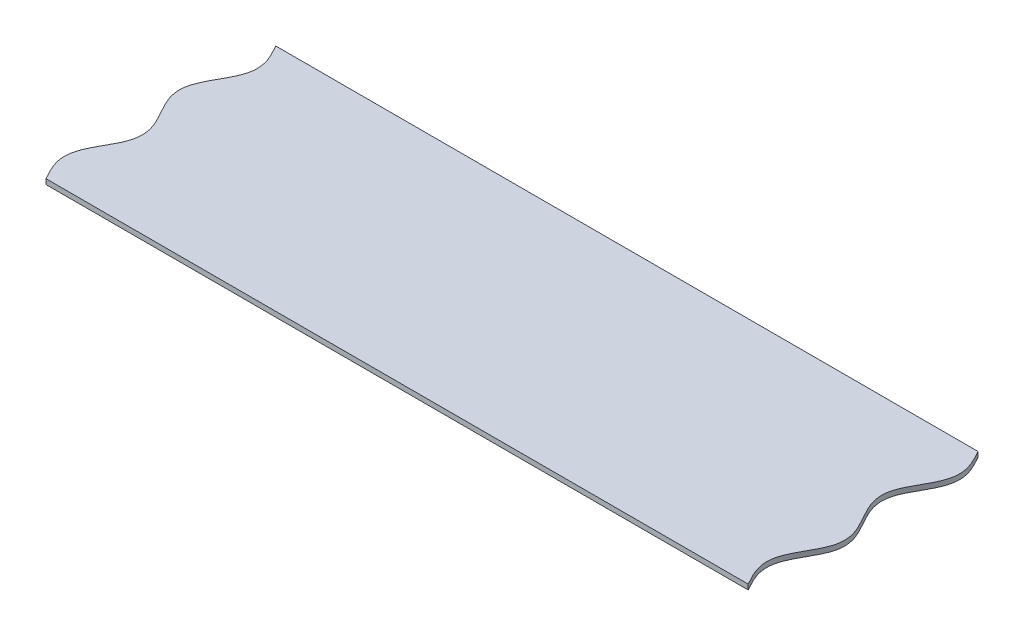
ISO-10303-21;
HEADER;
FILE_DESCRIPTION(('STEP AP214'),'2;1');
FILE_NAME('part.step','',(''),(''),'','','');
FILE_SCHEMA(('AUTOMOTIVE_DESIGN { 1 0 10303 214 1 1 1 1 }'));
ENDSEC;
DATA;
#1=APPLICATION_CONTEXT('core data for automotive mechanical design processes');
#2=APPLICATION_PROTOCOL_DEFINITION('international standard','automotive_design',2000,#1);
#3=PRODUCT_CONTEXT('',#1,'mechanical');
#4=PRODUCT('Part','Part','',(#3));
#5=PRODUCT_RELATED_PRODUCT_CATEGORY('part','',(#4));
#6=PRODUCT_DEFINITION_FORMATION('','',#4);
#7=PRODUCT_DEFINITION_CONTEXT('part definition',#1,'design');
#8=PRODUCT_DEFINITION('design','',#6,#7);
#9=PRODUCT_DEFINITION_SHAPE('','',#8);
#10=(LENGTH_UNIT() NAMED_UNIT(*) SI_UNIT(.MILLI.,.METRE.));
#11=(NAMED_UNIT(*) PLANE_ANGLE_UNIT() SI_UNIT($,.RADIAN.));
#12=(NAMED_UNIT(*) SI_UNIT($,.STERADIAN.) SOLID_ANGLE_UNIT());
#13=UNCERTAINTY_MEASURE_WITH_UNIT(LENGTH_MEASURE(1.E-05),#10,'distance_accuracy_value','');
#14=(GEOMETRIC_REPRESENTATION_CONTEXT(3) GLOBAL_UNCERTAINTY_ASSIGNED_CONTEXT((#13)) GLOBAL_UNIT_ASSIGNED_CONTEXT((#10,
#11,#12)) REPRESENTATION_CONTEXT('',''));
#15=CARTESIAN_POINT('',(0.,0.,0.));
#16=DIRECTION('',(0.,0.,1.));
#17=DIRECTION('',(1.,0.,0.));
#18=AXIS2_PLACEMENT_3D('',#15,#16,#17);
#19=CARTESIAN_POINT('',(-5.58170452742636E-08,0.4,-9.99341588722323E-08));
#20=CARTESIAN_POINT('',(0.0325246361291489,0.4,0.0582317103069612));
#21=CARTESIAN_POINT('',(0.0967328106936507,0.4,0.173184303372485));
#22=CARTESIAN_POINT('',(0.291982250759605,0.4,0.52619217590146));
#23=CARTESIAN_POINT('',(0.445208277670781,0.4,0.832698965412081));
#24=CARTESIAN_POINT('',(0.623865980151338,0.4,1.24407361378798));
#25=CARTESIAN_POINT('',(0.759592363237738,0.4,1.72118166675855));
#26=CARTESIAN_POINT('',(0.832859934923318,0.4,2.25154155185734));
#27=CARTESIAN_POINT('',(0.750726938043106,0.4,2.96558695409423));
#28=CARTESIAN_POINT('',(0.443708738434378,0.4,3.71577035640966));
#29=CARTESIAN_POINT('',(0.0504783736851124,0.4,4.41030283856117));
#30=CARTESIAN_POINT('',(-0.348670519029739,0.4,5.12241356073318));
#31=CARTESIAN_POINT('',(-0.648651089756492,0.4,5.7703470826826));
#32=CARTESIAN_POINT('',(-0.82672624794342,0.4,6.46899626847285));
#33=CARTESIAN_POINT('',(-0.7986136200232,0.4,7.25099648989018));
#34=CARTESIAN_POINT('',(-0.495285138172172,0.4,8.14226671619661));
#35=CARTESIAN_POINT('',(-7.22769396650366E-05,0.4,8.99998149250639));
#36=CARTESIAN_POINT('',(0.495425821745265,0.4,9.85776085122949));
#37=CARTESIAN_POINT('',(0.799655367243381,0.4,10.7484079758009));
#38=CARTESIAN_POINT('',(0.829148191709096,0.4,11.5306438006231));
#39=CARTESIAN_POINT('',(0.651829085490575,0.4,12.22905836892));
#40=CARTESIAN_POINT('',(0.389255062631136,0.4,12.7986412222162));
#41=CARTESIAN_POINT('',(0.131311319069625,0.4,13.2713983704557));
#42=CARTESIAN_POINT('',(-0.107552617844786,0.4,13.6967908903107));
#43=CARTESIAN_POINT('',(-0.324807927344972,0.4,14.0918313269295));
#44=CARTESIAN_POINT('',(-0.559532557967269,0.4,14.5777762998583));
#45=CARTESIAN_POINT('',(-0.765316945934337,0.4,15.1703385530119));
#46=CARTESIAN_POINT('',(-0.828444310587086,0.4,15.7519466591617));
#47=CARTESIAN_POINT('',(-0.762210707475533,0.4,16.2719762814522));
#48=CARTESIAN_POINT('',(-0.638913334329335,0.4,16.6907272139578));
#49=CARTESIAN_POINT('',(-0.52318723028198,0.4,16.9915644817052));
#50=CARTESIAN_POINT('',(-0.37091554487841,0.4,17.313254228399));
#51=CARTESIAN_POINT('',(-0.251032904852001,0.4,17.5477683372978));
#52=CARTESIAN_POINT('',(-0.0973118355511862,0.4,17.8257504179934));
#53=CARTESIAN_POINT('',(-0.0325246236280025,0.4,17.9417681484702));
#54=CARTESIAN_POINT('',(5.94193819027072E-12,0.4,18.0000000000106));
#55=B_SPLINE_CURVE_WITH_KNOTS('',4,(#19,#20,#21,#22,#23,#24,#25,#26,#27,#28,#29,#30,#31,#32,#33,
#34,#35,#36,#37,#38,#39,#40,#41,#42,#43,#44,#45,#46,#47,#48,#49,#50,#51,#52,#53,#54),
.UNSPECIFIED.,.F.,.F.,(5,1,1,1,1,1,1,1,1,1,1,1,1,1,1,1,1,1,1,1,1,1,1,1,1,1,1,1,1,1,1,1,5),
(0.0831333415081067,0.0969355766026035,0.110737817618864,0.138342299651385,0.153420911727594,
0.168499523803803,0.198656548097112,0.228813603984349,0.27648331462802,0.306640636588557,
0.336797958549095,0.369388933775316,0.399545924472748,0.429703067764272,0.469833247335096,
0.530147989865572,0.570278162450154,0.600435313453212,0.630592300086219,0.663183275804327,
0.6933405991003,0.708419260748287,0.723497922396273,0.747332774825081,0.771167627253889,
0.801324696016065,0.8314817160139,0.846560325859882,0.861638935705865,0.875441177287961,
0.889243418870057,0.903045660452153,0.916847902034249),.UNSPECIFIED.);
#56=DIRECTION('',(0.,-1.,0.));
#57=VECTOR('',#56,1.);
#58=SURFACE_OF_LINEAR_EXTRUSION('',#55,#57);
#59=CARTESIAN_POINT('',(-5.58170452742636E-08,0.,-9.99341588722323E-08));
#60=CARTESIAN_POINT('',(0.0325246361291489,0.,0.0582317103069612));
#61=CARTESIAN_POINT('',(0.0967328106936507,0.,0.173184303372485));
#62=CARTESIAN_POINT('',(0.291982250759605,0.,0.52619217590146));
#63=CARTESIAN_POINT('',(0.445208277670781,0.,0.832698965412081));
#64=CARTESIAN_POINT('',(0.623865980151338,0.,1.24407361378798));
#65=CARTESIAN_POINT('',(0.759592363237738,0.,1.72118166675855));
#66=CARTESIAN_POINT('',(0.832859934923318,0.,2.25154155185734));
#67=CARTESIAN_POINT('',(0.750726938043106,0.,2.96558695409423));
#68=CARTESIAN_POINT('',(0.443708738434378,0.,3.71577035640966));
#69=CARTESIAN_POINT('',(0.0504783736851124,0.,4.41030283856117));
#70=CARTESIAN_POINT('',(-0.348670519029739,0.,5.12241356073318));
#71=CARTESIAN_POINT('',(-0.648651089756492,0.,5.7703470826826));
#72=CARTESIAN_POINT('',(-0.82672624794342,0.,6.46899626847285));
#73=CARTESIAN_POINT('',(-0.7986136200232,0.,7.25099648989018));
#74=CARTESIAN_POINT('',(-0.495285138172172,0.,8.14226671619661));
#75=CARTESIAN_POINT('',(-7.22769396650366E-05,0.,8.99998149250639));
#76=CARTESIAN_POINT('',(0.495425821745265,0.,9.85776085122949));
#77=CARTESIAN_POINT('',(0.799655367243381,0.,10.7484079758009));
#78=CARTESIAN_POINT('',(0.829148191709096,0.,11.5306438006231));
#79=CARTESIAN_POINT('',(0.651829085490575,0.,12.22905836892));
#80=CARTESIAN_POINT('',(0.389255062631136,0.,12.7986412222162));
#81=CARTESIAN_POINT('',(0.131311319069625,0.,13.2713983704557));
#82=CARTESIAN_POINT('',(-0.107552617844786,0.,13.6967908903107));
#83=CARTESIAN_POINT('',(-0.324807927344972,0.,14.0918313269295));
#84=CARTESIAN_POINT('',(-0.559532557967269,0.,14.5777762998583));
#85=CARTESIAN_POINT('',(-0.765316945934337,0.,15.1703385530119));
#86=CARTESIAN_POINT('',(-0.828444310587086,0.,15.7519466591617));
#87=CARTESIAN_POINT('',(-0.762210707475533,0.,16.2719762814522));
#88=CARTESIAN_POINT('',(-0.638913334329335,0.,16.6907272139578));
#89=CARTESIAN_POINT('',(-0.52318723028198,0.,16.9915644817052));
#90=CARTESIAN_POINT('',(-0.37091554487841,0.,17.313254228399));
#91=CARTESIAN_POINT('',(-0.251032904852001,0.,17.5477683372978));
#92=CARTESIAN_POINT('',(-0.0973118355511862,0.,17.8257504179934));
#93=CARTESIAN_POINT('',(-0.0325246236280025,0.,17.9417681484702));
#94=CARTESIAN_POINT('',(5.94193819027072E-12,0.,18.0000000000106));
#95=B_SPLINE_CURVE_WITH_KNOTS('',4,(#59,#60,#61,#62,#63,#64,#65,#66,#67,#68,#69,#70,#71,#72,#73,
#74,#75,#76,#77,#78,#79,#80,#81,#82,#83,#84,#85,#86,#87,#88,#89,#90,#91,#92,#93,#94),
.UNSPECIFIED.,.F.,.F.,(5,1,1,1,1,1,1,1,1,1,1,1,1,1,1,1,1,1,1,1,1,1,1,1,1,1,1,1,1,1,1,1,5),
(0.0831333415081067,0.0969355766026035,0.110737817618864,0.138342299651385,0.153420911727594,
0.168499523803803,0.198656548097112,0.228813603984349,0.27648331462802,0.306640636588557,
0.336797958549095,0.369388933775316,0.399545924472748,0.429703067764272,0.469833247335096,
0.530147989865572,0.570278162450154,0.600435313453212,0.630592300086219,0.663183275804327,
0.6933405991003,0.708419260748287,0.723497922396273,0.747332774825081,0.771167627253889,
0.801324696016065,0.8314817160139,0.846560325859882,0.861638935705865,0.875441177287961,
0.889243418870057,0.903045660452153,0.916847902034249),.UNSPECIFIED.);
#96=CARTESIAN_POINT('',(0.,0.,0.));
#97=VERTEX_POINT('',#96);
#98=CARTESIAN_POINT('',(0.,0.,18.));
#99=VERTEX_POINT('',#98);
#100=EDGE_CURVE('E122',#97,#99,#95,.T.);
#101=ORIENTED_EDGE('',*,*,#100,.T.);
#102=DIRECTION('',(0.,-1.,0.));
#103=VECTOR('',#102,1.);
#104=CARTESIAN_POINT('',(0.,0.4,18.));
#105=LINE('',#104,#103);
#106=CARTESIAN_POINT('',(0.,0.4,18.));
#107=VERTEX_POINT('',#106);
#108=EDGE_CURVE('E11',#107,#99,#105,.T.);
#109=ORIENTED_EDGE('',*,*,#108,.F.);
#110=CARTESIAN_POINT('',(0.,0.4,0.));
#111=VERTEX_POINT('',#110);
#112=EDGE_CURVE('E91',#111,#107,#55,.T.);
#113=ORIENTED_EDGE('',*,*,#112,.F.);
#114=DIRECTION('',(0.,-1.,0.));
#115=VECTOR('',#114,1.);
#116=CARTESIAN_POINT('',(0.,0.4,0.));
#117=LINE('',#116,#115);
#118=EDGE_CURVE('E99',#111,#97,#117,.T.);
#119=ORIENTED_EDGE('',*,*,#118,.T.);
#120=EDGE_LOOP('',(#101,#109,#113,#119));
#121=FACE_BOUND('',#120,.T.);
#122=ADVANCED_FACE('F39',(#121),#58,.F.);
#123=CARTESIAN_POINT('',(55.,0.4,18.));
#124=DIRECTION('',(0.,0.,-1.));
#125=DIRECTION('',(-1.,0.,0.));
#126=AXIS2_PLACEMENT_3D('',#123,#124,#125);
#127=PLANE('',#126);
#128=DIRECTION('',(1.,0.,0.));
#129=VECTOR('',#128,1.);
#130=CARTESIAN_POINT('',(55.,0.,18.));
#131=LINE('',#130,#129);
#132=CARTESIAN_POINT('',(55.,0.,18.));
#133=VERTEX_POINT('',#132);
#134=EDGE_CURVE('E95',#99,#133,#131,.T.);
#135=ORIENTED_EDGE('',*,*,#134,.T.);
#136=DIRECTION('',(0.,-1.,0.));
#137=VECTOR('',#136,1.);
#138=CARTESIAN_POINT('',(55.,0.4,18.));
#139=LINE('',#138,#137);
#140=CARTESIAN_POINT('',(55.,0.4,18.));
#141=VERTEX_POINT('',#140);
#142=EDGE_CURVE('E48',#141,#133,#139,.T.);
#143=ORIENTED_EDGE('',*,*,#142,.F.);
#144=DIRECTION('',(1.,0.,0.));
#145=VECTOR('',#144,1.);
#146=CARTESIAN_POINT('',(55.,0.4,18.));
#147=LINE('',#146,#145);
#148=EDGE_CURVE('E86',#107,#141,#147,.T.);
#149=ORIENTED_EDGE('',*,*,#148,.F.);
#150=ORIENTED_EDGE('',*,*,#108,.T.);
#151=EDGE_LOOP('',(#135,#143,#149,#150));
#152=FACE_BOUND('',#151,.T.);
#153=ADVANCED_FACE('F94',(#152),#127,.F.);
#154=CARTESIAN_POINT('',(55.,0.4,18.));
#155=CARTESIAN_POINT('',(54.9674753765008,0.4,17.9417681487008));
#156=CARTESIAN_POINT('',(54.9027202884905,0.4,17.8258082156632));
#157=CARTESIAN_POINT('',(54.7492351508635,0.4,17.5482485311464));
#158=CARTESIAN_POINT('',(54.6288206352155,0.4,17.3127812640125));
#159=CARTESIAN_POINT('',(54.4769764896039,0.4,16.9918584269276));
#160=CARTESIAN_POINT('',(54.3610011192954,0.4,16.6905735432826));
#161=CARTESIAN_POINT('',(54.2378448673036,0.4,16.272076234869));
#162=CARTESIAN_POINT('',(54.1715158495587,0.4,15.7518747211653));
#163=CARTESIAN_POINT('',(54.2347102242873,0.4,15.1703875996461));
#164=CARTESIAN_POINT('',(54.4404493381463,0.4,14.577743855128));
#165=CARTESIAN_POINT('',(54.6752035613737,0.4,14.0918518921614));
#166=CARTESIAN_POINT('',(54.8924409656504,0.4,13.6967793938985));
#167=CARTESIAN_POINT('',(55.1313157015191,0.4,13.2714065505497));
#168=CARTESIAN_POINT('',(55.3892510732092,0.4,12.7986332961022));
#169=CARTESIAN_POINT('',(55.6518327999066,0.4,12.2290662728502));
#170=CARTESIAN_POINT('',(55.8291443910958,0.4,11.5306351960209));
#171=CARTESIAN_POINT('',(55.7996603664192,0.4,10.7484200452914));
#172=CARTESIAN_POINT('',(55.4954164971433,0.4,9.8577380554658));
#173=CARTESIAN_POINT('',(54.9999451827351,0.4,9.0000240249605));
#174=CARTESIAN_POINT('',(54.5046899462964,0.4,8.14220605976102));
#175=CARTESIAN_POINT('',(54.2014161349178,0.4,7.25106914201819));
#176=CARTESIAN_POINT('',(54.1732226961072,0.4,6.46887128682535));
#177=CARTESIAN_POINT('',(54.3514448414002,0.4,5.77058212710425));
#178=CARTESIAN_POINT('',(54.6511460127565,0.4,5.12196439950694));
#179=CARTESIAN_POINT('',(55.0508222238208,0.4,4.41114703190972));
#180=CARTESIAN_POINT('',(55.4431329910513,0.4,3.71434568871832));
#181=CARTESIAN_POINT('',(55.7178581640772,0.4,3.04910516458675));
#182=CARTESIAN_POINT('',(55.8121864627325,0.4,2.42501999239361));
#183=CARTESIAN_POINT('',(55.7979129623168,0.4,2.03100496406801));
#184=CARTESIAN_POINT('',(55.7598426255465,0.4,1.77104846639722));
#185=CARTESIAN_POINT('',(55.7105830653363,0.4,1.55808365198125));
#186=CARTESIAN_POINT('',(55.6621200151019,0.4,1.39012928445238));
#187=CARTESIAN_POINT('',(55.6064811076032,0.4,1.22803176322842));
#188=CARTESIAN_POINT('',(55.5457215452142,0.4,1.07206752498808));
#189=CARTESIAN_POINT('',(55.4898654897218,0.4,0.941699093404553));
#190=CARTESIAN_POINT('',(55.4372777687635,0.4,0.827999896575921));
#191=CARTESIAN_POINT('',(55.3929650322242,0.4,0.735760229529608));
#192=CARTESIAN_POINT('',(55.3598666770834,0.4,0.668018936471949));
#193=CARTESIAN_POINT('',(55.2840842797312,0.4,0.513554697790552));
#194=CARTESIAN_POINT('',(55.1340100572248,0.4,0.239928811409299));
#195=CARTESIAN_POINT('',(55.0650493613452,0.4,0.116463580113935));
#196=CARTESIAN_POINT('',(54.9999999777105,0.4,-3.99069456679443E-08));
#197=B_SPLINE_CURVE_WITH_KNOTS('',4,(#154,#155,#156,#157,#158,#159,#160,#161,#162,#163,#164,
#165,#166,#167,#168,#169,#170,#171,#172,#173,#174,#175,#176,#177,#178,#179,#180,#181,#182,#183,
#184,#185,#186,#187,#188,#189,#190,#191,#192,#193,#194,#195,#196),.UNSPECIFIED.,.F.,.F.,(5,1,1,
1,1,1,1,1,1,1,1,1,1,1,1,1,1,1,1,1,1,1,1,1,1,1,1,1,1,1,1,1,1,1,1,1,1,1,1,5),(0.0831333382870701,
0.0969355798635446,0.110737821440019,0.124540063016494,0.138342304592968,0.153420914432818,
0.168499524272668,0.198656544258242,0.228813613008115,0.252648465427231,0.276483317846347,
0.291561979488193,0.306640641130038,0.33679796441373,0.369388940118573,0.399545926739333,
0.429703077730066,0.469833250298368,0.530147992804299,0.570278172358721,0.600435315638055,
0.630592306323167,0.663183281536133,0.693340603484414,0.723497925432694,0.77116763605688,
0.801324691932041,0.816403204072525,0.831481716213009,0.839021022248028,0.846560328283048,
0.854099634318067,0.861638940353087,0.868540060858413,0.875441181363739,0.878891741616403,
0.882342301869066,0.885792862121729,0.889243422374392,0.916847902030493),.UNSPECIFIED.);
#198=DIRECTION('',(0.,-1.,0.));
#199=VECTOR('',#198,1.);
#200=SURFACE_OF_LINEAR_EXTRUSION('',#197,#199);
#201=CARTESIAN_POINT('',(55.,0.,18.));
#202=CARTESIAN_POINT('',(54.9674753765008,0.,17.9417681487008));
#203=CARTESIAN_POINT('',(54.9027202884905,0.,17.8258082156632));
#204=CARTESIAN_POINT('',(54.7492351508635,0.,17.5482485311464));
#205=CARTESIAN_POINT('',(54.6288206352155,0.,17.3127812640125));
#206=CARTESIAN_POINT('',(54.4769764896039,0.,16.9918584269276));
#207=CARTESIAN_POINT('',(54.3610011192954,0.,16.6905735432826));
#208=CARTESIAN_POINT('',(54.2378448673036,0.,16.272076234869));
#209=CARTESIAN_POINT('',(54.1715158495587,0.,15.7518747211653));
#210=CARTESIAN_POINT('',(54.2347102242873,0.,15.1703875996461));
#211=CARTESIAN_POINT('',(54.4404493381463,0.,14.577743855128));
#212=CARTESIAN_POINT('',(54.6752035613737,0.,14.0918518921614));
#213=CARTESIAN_POINT('',(54.8924409656504,0.,13.6967793938985));
#214=CARTESIAN_POINT('',(55.1313157015191,0.,13.2714065505497));
#215=CARTESIAN_POINT('',(55.3892510732092,0.,12.7986332961022));
#216=CARTESIAN_POINT('',(55.6518327999066,0.,12.2290662728502));
#217=CARTESIAN_POINT('',(55.8291443910958,0.,11.5306351960209));
#218=CARTESIAN_POINT('',(55.7996603664192,0.,10.7484200452914));
#219=CARTESIAN_POINT('',(55.4954164971433,0.,9.8577380554658));
#220=CARTESIAN_POINT('',(54.9999451827351,0.,9.0000240249605));
#221=CARTESIAN_POINT('',(54.5046899462964,0.,8.14220605976102));
#222=CARTESIAN_POINT('',(54.2014161349178,0.,7.25106914201819));
#223=CARTESIAN_POINT('',(54.1732226961072,0.,6.46887128682535));
#224=CARTESIAN_POINT('',(54.3514448414002,0.,5.77058212710425));
#225=CARTESIAN_POINT('',(54.6511460127565,0.,5.12196439950694));
#226=CARTESIAN_POINT('',(55.0508222238208,0.,4.41114703190972));
#227=CARTESIAN_POINT('',(55.4431329910513,0.,3.71434568871832));
#228=CARTESIAN_POINT('',(55.7178581640772,0.,3.04910516458675));
#229=CARTESIAN_POINT('',(55.8121864627325,0.,2.42501999239361));
#230=CARTESIAN_POINT('',(55.7979129623168,0.,2.03100496406801));
#231=CARTESIAN_POINT('',(55.7598426255465,0.,1.77104846639722));
#232=CARTESIAN_POINT('',(55.7105830653363,0.,1.55808365198125));
#233=CARTESIAN_POINT('',(55.6621200151019,0.,1.39012928445238));
#234=CARTESIAN_POINT('',(55.6064811076032,0.,1.22803176322842));
#235=CARTESIAN_POINT('',(55.5457215452142,0.,1.07206752498808));
#236=CARTESIAN_POINT('',(55.4898654897218,0.,0.941699093404553));
#237=CARTESIAN_POINT('',(55.4372777687635,0.,0.827999896575921));
#238=CARTESIAN_POINT('',(55.3929650322242,0.,0.735760229529608));
#239=CARTESIAN_POINT('',(55.3598666770834,0.,0.668018936471949));
#240=CARTESIAN_POINT('',(55.2840842797312,0.,0.513554697790552));
#241=CARTESIAN_POINT('',(55.1340100572248,0.,0.239928811409299));
#242=CARTESIAN_POINT('',(55.0650493613452,0.,0.116463580113935));
#243=CARTESIAN_POINT('',(54.9999999777105,0.,-3.99069456679443E-08));
#244=B_SPLINE_CURVE_WITH_KNOTS('',4,(#201,#202,#203,#204,#205,#206,#207,#208,#209,#210,#211,
#212,#213,#214,#215,#216,#217,#218,#219,#220,#221,#222,#223,#224,#225,#226,#227,#228,#229,#230,
#231,#232,#233,#234,#235,#236,#237,#238,#239,#240,#241,#242,#243),.UNSPECIFIED.,.F.,.F.,(5,1,1,
1,1,1,1,1,1,1,1,1,1,1,1,1,1,1,1,1,1,1,1,1,1,1,1,1,1,1,1,1,1,1,1,1,1,1,1,5),(0.0831333382870701,
0.0969355798635446,0.110737821440019,0.124540063016494,0.138342304592968,0.153420914432818,
0.168499524272668,0.198656544258242,0.228813613008115,0.252648465427231,0.276483317846347,
0.291561979488193,0.306640641130038,0.33679796441373,0.369388940118573,0.399545926739333,
0.429703077730066,0.469833250298368,0.530147992804299,0.570278172358721,0.600435315638055,
0.630592306323167,0.663183281536133,0.693340603484414,0.723497925432694,0.77116763605688,
0.801324691932041,0.816403204072525,0.831481716213009,0.839021022248028,0.846560328283048,
0.854099634318067,0.861638940353087,0.868540060858413,0.875441181363739,0.878891741616403,
0.882342301869066,0.885792862121729,0.889243422374392,0.916847902030493),.UNSPECIFIED.);
#245=CARTESIAN_POINT('',(55.,0.,0.));
#246=VERTEX_POINT('',#245);
#247=EDGE_CURVE('E73',#133,#246,#244,.T.);
#248=ORIENTED_EDGE('',*,*,#247,.T.);
#249=DIRECTION('',(0.,-1.,0.));
#250=VECTOR('',#249,1.);
#251=CARTESIAN_POINT('',(55.,0.4,0.));
#252=LINE('',#251,#250);
#253=CARTESIAN_POINT('',(55.,0.4,0.));
#254=VERTEX_POINT('',#253);
#255=EDGE_CURVE('E96',#254,#246,#252,.T.);
#256=ORIENTED_EDGE('',*,*,#255,.F.);
#257=EDGE_CURVE('E89',#141,#254,#197,.T.);
#258=ORIENTED_EDGE('',*,*,#257,.F.);
#259=ORIENTED_EDGE('',*,*,#142,.T.);
#260=EDGE_LOOP('',(#248,#256,#258,#259));
#261=FACE_BOUND('',#260,.T.);
#262=ADVANCED_FACE('F97',(#261),#200,.F.);
#263=CARTESIAN_POINT('',(0.,0.4,0.));
#264=DIRECTION('',(0.,0.,1.));
#265=DIRECTION('',(1.,0.,0.));
#266=AXIS2_PLACEMENT_3D('',#263,#264,#265);
#267=PLANE('',#266);
#268=DIRECTION('',(-1.,0.,0.));
#269=VECTOR('',#268,1.);
#270=CARTESIAN_POINT('',(0.,0.,0.));
#271=LINE('',#270,#269);
#272=EDGE_CURVE('E79',#246,#97,#271,.T.);
#273=ORIENTED_EDGE('',*,*,#272,.T.);
#274=ORIENTED_EDGE('',*,*,#118,.F.);
#275=DIRECTION('',(-1.,0.,0.));
#276=VECTOR('',#275,1.);
#277=CARTESIAN_POINT('',(0.,0.4,0.));
#278=LINE('',#277,#276);
#279=EDGE_CURVE('E56',#254,#111,#278,.T.);
#280=ORIENTED_EDGE('',*,*,#279,.F.);
#281=ORIENTED_EDGE('',*,*,#255,.T.);
#282=EDGE_LOOP('',(#273,#274,#280,#281));
#283=FACE_BOUND('',#282,.T.);
#284=ADVANCED_FACE('F111',(#283),#267,.F.);
#285=CARTESIAN_POINT('',(-1.83579328435601E-06,0.4,8.99999214209239));
#286=DIRECTION('',(0.,1.,0.));
#287=DIRECTION('',(0.,0.,1.));
#288=AXIS2_PLACEMENT_3D('',#285,#286,#287);
#289=PLANE('',#288);
#290=ORIENTED_EDGE('',*,*,#112,.T.);
#291=ORIENTED_EDGE('',*,*,#148,.T.);
#292=ORIENTED_EDGE('',*,*,#257,.T.);
#293=ORIENTED_EDGE('',*,*,#279,.T.);
#294=EDGE_LOOP('',(#290,#291,#292,#293));
#295=FACE_BOUND('',#294,.T.);
#296=ADVANCED_FACE('F87',(#295),#289,.T.);
#297=CARTESIAN_POINT('',(-1.83579328435601E-06,0.,8.99999214209239));
#298=DIRECTION('',(0.,1.,0.));
#299=DIRECTION('',(0.,0.,1.));
#300=AXIS2_PLACEMENT_3D('',#297,#298,#299);
#301=PLANE('',#300);
#302=ORIENTED_EDGE('',*,*,#100,.F.);
#303=ORIENTED_EDGE('',*,*,#272,.F.);
#304=ORIENTED_EDGE('',*,*,#247,.F.);
#305=ORIENTED_EDGE('',*,*,#134,.F.);
#306=EDGE_LOOP('',(#302,#303,#304,#305));
#307=FACE_BOUND('',#306,.T.);
#308=ADVANCED_FACE('F139',(#307),#301,.F.);
#309=CLOSED_SHELL('',(#122,#153,#262,#284,#296,#308));
#310=MANIFOLD_SOLID_BREP('B2',#309);
#311=ADVANCED_BREP_SHAPE_REPRESENTATION('',(#18,#310),#14);
#312=SHAPE_DEFINITION_REPRESENTATION(#9,#311);
ENDSEC;
END-ISO-10303-21;
